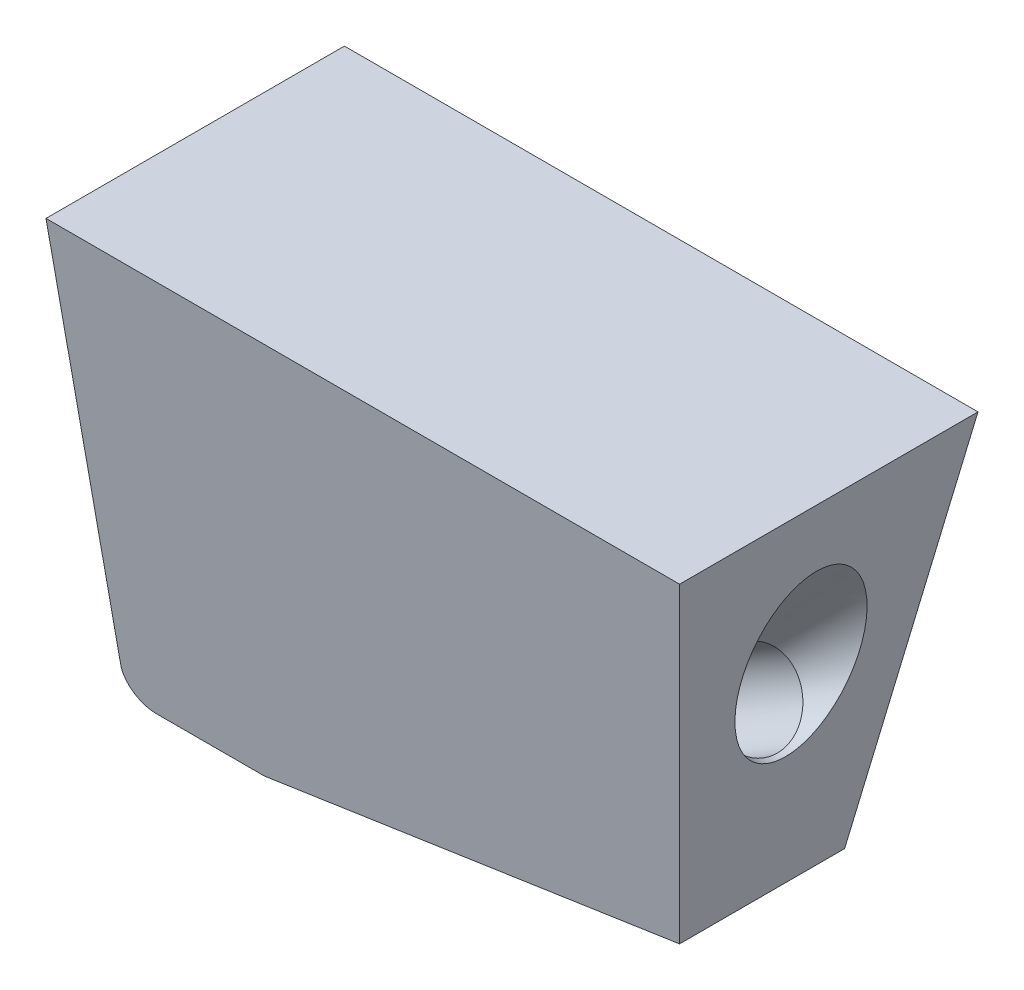
ISO-10303-21;
HEADER;
FILE_DESCRIPTION(('STEP AP214'),'2;1');
FILE_NAME('part.step','',(''),(''),'','','');
FILE_SCHEMA(('AUTOMOTIVE_DESIGN { 1 0 10303 214 1 1 1 1 }'));
ENDSEC;
DATA;
#1=APPLICATION_CONTEXT('core data for automotive mechanical design processes');
#2=APPLICATION_PROTOCOL_DEFINITION('international standard','automotive_design',2000,#1);
#3=PRODUCT_CONTEXT('',#1,'mechanical');
#4=PRODUCT('Part','Part','',(#3));
#5=PRODUCT_RELATED_PRODUCT_CATEGORY('part','',(#4));
#6=PRODUCT_DEFINITION_FORMATION('','',#4);
#7=PRODUCT_DEFINITION_CONTEXT('part definition',#1,'design');
#8=PRODUCT_DEFINITION('design','',#6,#7);
#9=PRODUCT_DEFINITION_SHAPE('','',#8);
#10=(LENGTH_UNIT() NAMED_UNIT(*) SI_UNIT(.MILLI.,.METRE.));
#11=(NAMED_UNIT(*) PLANE_ANGLE_UNIT() SI_UNIT($,.RADIAN.));
#12=(NAMED_UNIT(*) SI_UNIT($,.STERADIAN.) SOLID_ANGLE_UNIT());
#13=UNCERTAINTY_MEASURE_WITH_UNIT(LENGTH_MEASURE(1.E-05),#10,'distance_accuracy_value','');
#14=(GEOMETRIC_REPRESENTATION_CONTEXT(3) GLOBAL_UNCERTAINTY_ASSIGNED_CONTEXT((#13)) GLOBAL_UNIT_ASSIGNED_CONTEXT((#10,
#11,#12)) REPRESENTATION_CONTEXT('',''));
#15=CARTESIAN_POINT('',(0.,0.,0.));
#16=DIRECTION('',(0.,0.,1.));
#17=DIRECTION('',(1.,0.,0.));
#18=AXIS2_PLACEMENT_3D('',#15,#16,#17);
#19=CARTESIAN_POINT('',(38.0505893023531,0.,0.0635));
#20=DIRECTION('',(0.,-0.173648177666931,0.984807753012208));
#21=DIRECTION('',(0.,-0.984807753012208,-0.173648177666931));
#22=AXIS2_PLACEMENT_3D('',#19,#20,#21);
#23=PLANE('',#22);
#24=DIRECTION('',(-0.171087869746036,-0.970287525247814,-0.171087869746036));
#25=VECTOR('',#24,1.);
#26=CARTESIAN_POINT('',(1.24199492958802,6.29464036149478,1.17341492958802));
#27=LINE('',#26,#25);
#28=CARTESIAN_POINT('',(0.205511421413062,0.416450285248573,0.136931421413059));
#29=VERTEX_POINT('',#28);
#30=CARTESIAN_POINT('',(0.144305865656665,0.069336329627712,0.0757258656566614));
#31=VERTEX_POINT('',#30);
#32=EDGE_CURVE('E428',#29,#31,#27,.T.);
#33=ORIENTED_EDGE('',*,*,#32,.F.);
#34=DIRECTION('',(-1.,0.,0.));
#35=VECTOR('',#34,1.);
#36=CARTESIAN_POINT('',(38.0505893023531,0.416450285248574,0.13693142141306));
#37=LINE('',#36,#35);
#38=CARTESIAN_POINT('',(-0.37592,0.416450285248574,0.136931421413061));
#39=VERTEX_POINT('',#38);
#40=EDGE_CURVE('E76',#29,#39,#37,.T.);
#41=ORIENTED_EDGE('',*,*,#40,.T.);
#42=DIRECTION('',(0.,0.984807753012208,0.173648177666931));
#43=VECTOR('',#42,1.);
#44=CARTESIAN_POINT('',(-0.37592,28.9472979590388,5.16768964878566));
#45=LINE('',#44,#43);
#46=CARTESIAN_POINT('',(-0.37592,0.0255594358987837,0.0680068181606449));
#47=VERTEX_POINT('',#46);
#48=EDGE_CURVE('E271',#47,#39,#45,.T.);
#49=ORIENTED_EDGE('',*,*,#48,.F.);
#50=CARTESIAN_POINT('',(-0.3480816,0.02794,0.0684265758409963));
#51=DIRECTION('',(0.,-0.173648177666931,0.984807753012208));
#52=DIRECTION('',(0.,-0.984807753012208,-0.173648177666931));
#53=AXIS2_PLACEMENT_3D('',#50,#51,#52);
#54=ELLIPSE('',#53,0.0283710195360877,0.02794);
#55=CARTESIAN_POINT('',(-0.3480816,0.,0.0635000000000018));
#56=VERTEX_POINT('',#55);
#57=EDGE_CURVE('E228',#56,#47,#54,.F.);
#58=ORIENTED_EDGE('',*,*,#57,.F.);
#59=DIRECTION('',(-1.,0.,0.));
#60=VECTOR('',#59,1.);
#61=CARTESIAN_POINT('',(38.0505893023531,0.,0.0635));
#62=LINE('',#61,#60);
#63=CARTESIAN_POINT('',(-0.248920000000007,0.,0.0635));
#64=VERTEX_POINT('',#63);
#65=EDGE_CURVE('E432',#64,#56,#62,.T.);
#66=ORIENTED_EDGE('',*,*,#65,.F.);
#67=DIRECTION('',(-0.984346441568213,-0.173566836012845,-0.0306045161452665));
#68=VECTOR('',#67,1.);
#69=CARTESIAN_POINT('',(36.8609267666167,6.54346723491135,1.21728982089669));
#70=LINE('',#69,#68);
#71=EDGE_CURVE('E430',#31,#64,#70,.T.);
#72=ORIENTED_EDGE('',*,*,#71,.F.);
#73=EDGE_LOOP('',(#33,#41,#49,#58,#66,#72));
#74=FACE_BOUND('',#73,.T.);
#75=ADVANCED_FACE('F47',(#74),#23,.T.);
#76=CARTESIAN_POINT('',(38.0505893023531,0.,-0.0635));
#77=DIRECTION('',(0.,-0.173648177666931,-0.984807753012208));
#78=DIRECTION('',(0.,0.984807753012208,-0.173648177666931));
#79=AXIS2_PLACEMENT_3D('',#76,#77,#78);
#80=PLANE('',#79);
#81=DIRECTION('',(0.,-0.984807753012208,0.173648177666931));
#82=VECTOR('',#81,1.);
#83=CARTESIAN_POINT('',(-0.37592,29.2217622768144,-5.21608511325123));
#84=LINE('',#83,#82);
#85=CARTESIAN_POINT('',(-0.37592,0.416450285248574,-0.136931421413061));
#86=VERTEX_POINT('',#85);
#87=CARTESIAN_POINT('',(-0.37592,0.0255594358987837,-0.0680068181606441));
#88=VERTEX_POINT('',#87);
#89=EDGE_CURVE('E55',#86,#88,#84,.T.);
#90=ORIENTED_EDGE('',*,*,#89,.F.);
#91=DIRECTION('',(1.,0.,0.));
#92=VECTOR('',#91,1.);
#93=CARTESIAN_POINT('',(38.0505893023531,0.416450285248574,-0.13693142141306));
#94=LINE('',#93,#92);
#95=CARTESIAN_POINT('',(0.205511421413062,0.416450285248573,-0.136931421413059));
#96=VERTEX_POINT('',#95);
#97=EDGE_CURVE('E199',#86,#96,#94,.T.);
#98=ORIENTED_EDGE('',*,*,#97,.T.);
#99=DIRECTION('',(0.171087869746036,0.970287525247814,-0.171087869746036));
#100=VECTOR('',#99,1.);
#101=CARTESIAN_POINT('',(1.24199492958802,6.29464036149478,-1.17341492958802));
#102=LINE('',#101,#100);
#103=CARTESIAN_POINT('',(0.144305865656665,0.069336329627712,-0.0757258656566614));
#104=VERTEX_POINT('',#103);
#105=EDGE_CURVE('E188',#104,#96,#102,.T.);
#106=ORIENTED_EDGE('',*,*,#105,.F.);
#107=DIRECTION('',(0.984346441568213,0.173566836012845,-0.0306045161452665));
#108=VECTOR('',#107,1.);
#109=CARTESIAN_POINT('',(36.8609267666167,6.54346723491135,-1.21728982089669));
#110=LINE('',#109,#108);
#111=CARTESIAN_POINT('',(-0.248920000000007,0.,-0.0635));
#112=VERTEX_POINT('',#111);
#113=EDGE_CURVE('E196',#112,#104,#110,.T.);
#114=ORIENTED_EDGE('',*,*,#113,.F.);
#115=DIRECTION('',(-1.,0.,0.));
#116=VECTOR('',#115,1.);
#117=CARTESIAN_POINT('',(38.0505893023531,0.,-0.0635));
#118=LINE('',#117,#116);
#119=CARTESIAN_POINT('',(-0.3480816,0.,-0.0635000000000018));
#120=VERTEX_POINT('',#119);
#121=EDGE_CURVE('E273',#112,#120,#118,.T.);
#122=ORIENTED_EDGE('',*,*,#121,.T.);
#123=CARTESIAN_POINT('',(-0.3480816,0.02794,-0.0684265758409963));
#124=DIRECTION('',(0.,-0.173648177666931,-0.984807753012208));
#125=DIRECTION('',(0.,0.984807753012208,-0.173648177666931));
#126=AXIS2_PLACEMENT_3D('',#123,#124,#125);
#127=ELLIPSE('',#126,0.0283710195360877,0.02794);
#128=EDGE_CURVE('E225',#88,#120,#127,.F.);
#129=ORIENTED_EDGE('',*,*,#128,.F.);
#130=EDGE_LOOP('',(#90,#98,#106,#114,#122,#129));
#131=FACE_BOUND('',#130,.T.);
#132=ADVANCED_FACE('F200',(#131),#80,.T.);
#133=CARTESIAN_POINT('',(-0.37592,29.999999944,-0.80247998));
#134=DIRECTION('',(-1.,0.,0.));
#135=DIRECTION('',(0.,0.,1.));
#136=AXIS2_PLACEMENT_3D('',#133,#134,#135);
#137=PLANE('',#136);
#138=ORIENTED_EDGE('',*,*,#48,.T.);
#139=DIRECTION('',(0.,0.,-1.));
#140=VECTOR('',#139,1.);
#141=CARTESIAN_POINT('',(-0.37592,0.416450285248574,-0.80247998));
#142=LINE('',#141,#140);
#143=EDGE_CURVE('E68',#39,#86,#142,.T.);
#144=ORIENTED_EDGE('',*,*,#143,.T.);
#145=ORIENTED_EDGE('',*,*,#89,.T.);
#146=DIRECTION('',(0.,0.,-1.));
#147=VECTOR('',#146,1.);
#148=CARTESIAN_POINT('',(-0.37592,0.0255594358987817,37.5951067577949));
#149=LINE('',#148,#147);
#150=CARTESIAN_POINT('',(-0.375920000001808,0.0255595461338475,-0.0104837956292339));
#151=VERTEX_POINT('',#150);
#152=EDGE_CURVE('E211',#151,#88,#149,.T.);
#153=ORIENTED_EDGE('',*,*,#152,.F.);
#154=CARTESIAN_POINT('',(-0.37592,0.,0.0344056364847241));
#155=CARTESIAN_POINT('',(-0.37592,0.0144116560088984,0.0253708990055392));
#156=CARTESIAN_POINT('',(-0.37592,0.0284500319999992,0.0130238328179267));
#157=CARTESIAN_POINT('',(-0.37592,0.0284500319999992,-0.0130238328179267));
#158=CARTESIAN_POINT('',(-0.37592,0.0144116560088978,-0.0253708990055382));
#159=CARTESIAN_POINT('',(-0.37592,0.,-0.0344056364847241));
#160=(BOUNDED_CURVE() B_SPLINE_CURVE(3,(#154,#155,#156,#157,#158,#159),.UNSPECIFIED.,.F.,
.F.) B_SPLINE_CURVE_WITH_KNOTS((4,2,4),(1.39396020154298,1.5707963267949,1.74763245204681),
.UNSPECIFIED.) CURVE() GEOMETRIC_REPRESENTATION_ITEM() RATIONAL_B_SPLINE_CURVE((1.,1.,1.,1.,1.,1.)) REPRESENTATION_ITEM(''));
#161=CARTESIAN_POINT('',(-0.375920000000088,0.0255597991466438,0.0106336087855801));
#162=VERTEX_POINT('',#161);
#163=EDGE_CURVE('E351',#151,#162,#160,.F.);
#164=ORIENTED_EDGE('',*,*,#163,.T.);
#165=EDGE_CURVE('E220',#47,#162,#149,.T.);
#166=ORIENTED_EDGE('',*,*,#165,.F.);
#167=EDGE_LOOP('',(#138,#144,#145,#153,#164,#166));
#168=FACE_BOUND('',#167,.T.);
#169=ADVANCED_FACE('F319',(#168),#137,.T.);
#170=CARTESIAN_POINT('',(0.144305865656661,0.0693363296277119,38.4527456938784));
#171=DIRECTION('',(-0.984807753012208,0.173648177666931,0.));
#172=DIRECTION('',(-0.173648177666931,-0.984807753012208,0.));
#173=AXIS2_PLACEMENT_3D('',#170,#171,#172);
#174=PLANE('',#173);
#175=CARTESIAN_POINT('',(0.180009189299949,0.271819939905814,0.));
#176=DIRECTION('',(-0.984807753012208,0.173648177666931,0.));
#177=DIRECTION('',(0.173648177666931,0.984807753012208,0.));
#178=AXIS2_PLACEMENT_3D('',#175,#176,#177);
#179=ELLIPSE('',#178,0.0820660548594051,0.0589468715440828);
#180=CARTESIAN_POINT('',(0.194259810174599,0.352639226990481,0.));
#181=VERTEX_POINT('',#180);
#182=EDGE_CURVE('E281',#181,#181,#179,.F.);
#183=ORIENTED_EDGE('',*,*,#182,.F.);
#184=EDGE_LOOP('',(#183));
#185=FACE_BOUND('',#184,.T.);
#186=DIRECTION('',(0.,0.,-1.));
#187=VECTOR('',#186,1.);
#188=CARTESIAN_POINT('',(0.20551142141306,0.416450285248574,38.4527456938784));
#189=LINE('',#188,#187);
#190=EDGE_CURVE('E13',#29,#96,#189,.T.);
#191=ORIENTED_EDGE('',*,*,#190,.F.);
#192=ORIENTED_EDGE('',*,*,#32,.T.);
#193=DIRECTION('',(0.,0.,-1.));
#194=VECTOR('',#193,1.);
#195=CARTESIAN_POINT('',(0.144305865656661,0.0693363296277119,38.4527456938784));
#196=LINE('',#195,#194);
#197=EDGE_CURVE('E192',#31,#104,#196,.T.);
#198=ORIENTED_EDGE('',*,*,#197,.T.);
#199=ORIENTED_EDGE('',*,*,#105,.T.);
#200=EDGE_LOOP('',(#191,#192,#198,#199));
#201=FACE_BOUND('',#200,.T.);
#202=ADVANCED_FACE('F190',(#185,#201),#174,.F.);
#203=CARTESIAN_POINT('',(-0.171667122138084,0.1016,0.));
#204=DIRECTION('',(-0.500000000000004,-0.866025403784436,0.));
#205=DIRECTION('',(0.866025403784436,-0.500000000000004,0.));
#206=AXIS2_PLACEMENT_3D('',#203,#204,#205);
#207=CYLINDRICAL_SURFACE('',#206,0.0381);
#208=DIRECTION('',(-0.500000000000004,-0.866025403784436,0.));
#209=VECTOR('',#208,1.);
#210=CARTESIAN_POINT('',(-0.204201190820005,0.120383553311342,-0.00635));
#211=LINE('',#210,#209);
#212=CARTESIAN_POINT('',(-0.272003262441957,0.00294692040371896,-0.00635));
#213=VERTEX_POINT('',#212);
#214=CARTESIAN_POINT('',(-0.268982486856643,0.00817905719572654,-0.00635));
#215=VERTEX_POINT('',#214);
#216=EDGE_CURVE('E382',#213,#215,#211,.F.);
#217=ORIENTED_EDGE('',*,*,#216,.F.);
#218=CARTESIAN_POINT('',(-0.249224310763388,0.,0.0344056364847241));
#219=CARTESIAN_POINT('',(-0.251265245513699,0.000155917306499135,0.0335303011976228));
#220=CARTESIAN_POINT('',(-0.253236567155342,0.000336014453717778,0.0324909079121564));
#221=CARTESIAN_POINT('',(-0.256983796712376,0.00072352868299341,0.0301021833312435));
#222=CARTESIAN_POINT('',(-0.258759296959109,0.000931000855470363,0.0287522228545877));
#223=CARTESIAN_POINT('',(-0.262054353244601,0.00135198658208284,0.0257602082717701));
#224=CARTESIAN_POINT('',(-0.263573197137218,0.00156551508635467,0.0241173666119413));
#225=CARTESIAN_POINT('',(-0.266291813079525,0.00197164304030214,0.0205865947475717));
#226=CARTESIAN_POINT('',(-0.267492010712885,0.00216427020026648,0.0186989965092804));
#227=CARTESIAN_POINT('',(-0.269475334220566,0.00249507377987533,0.0148426291652261));
#228=CARTESIAN_POINT('',(-0.270277671839551,0.00263565101455654,0.0128839369199149));
#229=CARTESIAN_POINT('',(-0.271533243727165,0.00285993681419484,0.00885378156277107));
#230=CARTESIAN_POINT('',(-0.271986410841035,0.00294363443932775,0.0067822968399316));
#231=CARTESIAN_POINT('',(-0.272518765038474,0.00304233266407193,0.00266506377781953));
#232=CARTESIAN_POINT('',(-0.27261061843031,0.0030596593900815,0.00062099861260328));
#233=CARTESIAN_POINT('',(-0.272452629451527,0.00303015093454702,-0.0034532328046629));
#234=CARTESIAN_POINT('',(-0.272202831591659,0.00298332411100644,-0.00548340083262045));
#235=CARTESIAN_POINT('',(-0.271372653345109,0.00283138270163566,-0.00945512049332519));
#236=CARTESIAN_POINT('',(-0.270795000220922,0.00272674916927935,-0.0113972622206664));
#237=CARTESIAN_POINT('',(-0.269328904751489,0.00247098947414516,-0.0151563247424012));
#238=CARTESIAN_POINT('',(-0.268440552540626,0.00231987679658471,-0.0169732816703509));
#239=CARTESIAN_POINT('',(-0.266368991187112,0.00198552937614492,-0.0204536657019332));
#240=CARTESIAN_POINT('',(-0.265182712393849,0.00180196651192054,-0.022115230572601));
#241=CARTESIAN_POINT('',(-0.262555851832211,0.0014229728531968,-0.0252239838253833));
#242=CARTESIAN_POINT('',(-0.261115035994521,0.00122753124459592,-0.0266709726134355));
#243=CARTESIAN_POINT('',(-0.258022710724875,0.00084452863222295,-0.0293197711057591));
#244=CARTESIAN_POINT('',(-0.25637112720222,0.000656970430658043,-0.0305214942043257));
#245=CARTESIAN_POINT('',(-0.252907096238622,0.000306276558369561,-0.0326627490190239));
#246=CARTESIAN_POINT('',(-0.251094919946924,0.000143100925457669,-0.0336027119846616));
#247=CARTESIAN_POINT('',(-0.249224310763386,0.,-0.0344056364847213));
#248=B_SPLINE_CURVE_WITH_KNOTS('',3,(#218,#219,#220,#221,#222,#223,#224,#225,#226,#227,#228,
#229,#230,#231,#232,#233,#234,#235,#236,#237,#238,#239,#240,#241,#242,#243,#244,#245,#246,#247),
.UNSPECIFIED.,.F.,.F.,(4,2,2,2,2,2,2,2,2,2,2,2,2,2,4),(0.,0.00667534853800554,
0.0133643417163049,0.0200716005253053,0.0267698555389964,0.0331019733540892,0.0394353086997849,
0.0455445309233154,0.0516529573055327,0.0577113002609494,0.0637678871356552,0.0698896393995987,
0.0760170507409397,0.0821466220017567,0.0882660342390724),.UNSPECIFIED.);
#249=CARTESIAN_POINT('',(-0.249224310763389,0.,-0.034405636484724));
#250=VERTEX_POINT('',#249);
#251=EDGE_CURVE('E304',#213,#250,#248,.T.);
#252=ORIENTED_EDGE('',*,*,#251,.T.);
#253=CARTESIAN_POINT('',(-0.230325909487751,0.,0.));
#254=DIRECTION('',(0.,1.,0.));
#255=DIRECTION('',(-1.,0.,0.));
#256=AXIS2_PLACEMENT_3D('',#253,#254,#255);
#257=ELLIPSE('',#256,0.0439940905122496,0.0381);
#258=CARTESIAN_POINT('',(-0.24892,0.,-0.034529767571137));
#259=VERTEX_POINT('',#258);
#260=EDGE_CURVE('E420',#250,#259,#257,.F.);
#261=ORIENTED_EDGE('',*,*,#260,.T.);
#262=CARTESIAN_POINT('',(-0.228218440422588,0.00365024349624154,0.));
#263=DIRECTION('',(-0.173648177666931,0.984807753012208,0.));
#264=DIRECTION('',(-0.984807753012208,-0.173648177666931,0.));
#265=AXIS2_PLACEMENT_3D('',#262,#263,#264);
#266=ELLIPSE('',#265,0.0497360177235601,0.0381);
#267=CARTESIAN_POINT('',(-0.228218440422588,0.00365024349624158,-0.0380999999999996));
#268=VERTEX_POINT('',#267);
#269=EDGE_CURVE('E289',#268,#259,#266,.T.);
#270=ORIENTED_EDGE('',*,*,#269,.F.);
#271=DIRECTION('',(0.500000000000004,0.866025403784436,0.));
#272=VECTOR('',#271,1.);
#273=CARTESIAN_POINT('',(-0.171667122138084,0.1016,-0.0381));
#274=LINE('',#273,#272);
#275=CARTESIAN_POINT('',(-0.171667122138084,0.1016,-0.0381));
#276=VERTEX_POINT('',#275);
#277=EDGE_CURVE('E416',#268,#276,#274,.T.);
#278=ORIENTED_EDGE('',*,*,#277,.T.);
#279=CARTESIAN_POINT('',(-0.171667122138084,0.1016,0.));
#280=DIRECTION('',(0.,-1.,0.));
#281=DIRECTION('',(-1.,0.,0.));
#282=AXIS2_PLACEMENT_3D('',#279,#280,#281);
#283=ELLIPSE('',#282,0.0439940905122496,0.0381);
#284=CARTESIAN_POINT('',(-0.171667122138084,0.1016,0.0381));
#285=VERTEX_POINT('',#284);
#286=EDGE_CURVE('E418',#276,#285,#283,.F.);
#287=ORIENTED_EDGE('',*,*,#286,.T.);
#288=DIRECTION('',(-0.500000000000004,-0.866025403784436,0.));
#289=VECTOR('',#288,1.);
#290=CARTESIAN_POINT('',(-0.172744432115812,0.0997340443830741,0.0381));
#291=LINE('',#290,#289);
#292=CARTESIAN_POINT('',(-0.228218440422588,0.00365024349624157,0.0380999999999996));
#293=VERTEX_POINT('',#292);
#294=EDGE_CURVE('E410',#285,#293,#291,.T.);
#295=ORIENTED_EDGE('',*,*,#294,.T.);
#296=CARTESIAN_POINT('',(-0.24892,0.,0.034529767571137));
#297=VERTEX_POINT('',#296);
#298=EDGE_CURVE('E293',#297,#293,#266,.T.);
#299=ORIENTED_EDGE('',*,*,#298,.F.);
#300=CARTESIAN_POINT('',(-0.249224310763388,0.,0.0344056364847241));
#301=VERTEX_POINT('',#300);
#302=EDGE_CURVE('E284',#297,#301,#257,.F.);
#303=ORIENTED_EDGE('',*,*,#302,.T.);
#304=CARTESIAN_POINT('',(-0.272003262441946,0.00294692040371905,0.00634999999999807));
#305=VERTEX_POINT('',#304);
#306=EDGE_CURVE('E295',#301,#305,#248,.T.);
#307=ORIENTED_EDGE('',*,*,#306,.T.);
#308=DIRECTION('',(-0.500000000000004,-0.866025403784436,0.));
#309=VECTOR('',#308,1.);
#310=CARTESIAN_POINT('',(-0.204201190820005,0.120383553311342,0.00635));
#311=LINE('',#310,#309);
#312=CARTESIAN_POINT('',(-0.268982486856643,0.00817905719572654,0.00635));
#313=VERTEX_POINT('',#312);
#314=EDGE_CURVE('E459',#305,#313,#311,.F.);
#315=ORIENTED_EDGE('',*,*,#314,.T.);
#316=CARTESIAN_POINT('',(-0.268982486856643,-0.0669551560496381,0.));
#317=DIRECTION('',(1.,0.,0.));
#318=DIRECTION('',(0.,-1.,0.));
#319=AXIS2_PLACEMENT_3D('',#316,#317,#318);
#320=ELLIPSE('',#319,0.0761999999999994,0.0381);
#321=CARTESIAN_POINT('',(-0.268982486856643,0.00924484395036143,0.));
#322=VERTEX_POINT('',#321);
#323=EDGE_CURVE('E371',#313,#322,#320,.F.);
#324=ORIENTED_EDGE('',*,*,#323,.T.);
#325=EDGE_CURVE('E443',#322,#215,#320,.F.);
#326=ORIENTED_EDGE('',*,*,#325,.T.);
#327=EDGE_LOOP('',(#217,#252,#261,#270,#278,#287,#295,#299,#303,#307,#315,#324,#326));
#328=FACE_BOUND('',#327,.T.);
#329=ADVANCED_FACE('F307',(#328),#207,.F.);
#330=CARTESIAN_POINT('',(37.8918393023531,-0.192529968,0.));
#331=DIRECTION('',(-1.,0.,0.));
#332=DIRECTION('',(0.,0.,1.));
#333=AXIS2_PLACEMENT_3D('',#330,#331,#332);
#334=CYLINDRICAL_SURFACE('',#333,0.19558);
#335=DIRECTION('',(-1.,0.,0.));
#336=VECTOR('',#335,1.);
#337=CARTESIAN_POINT('',(37.8918393023531,0.,0.0344056364847241));
#338=LINE('',#337,#336);
#339=CARTESIAN_POINT('',(-0.348081600000001,0.,0.0344056364847257));
#340=VERTEX_POINT('',#339);
#341=EDGE_CURVE('E373',#301,#340,#338,.T.);
#342=ORIENTED_EDGE('',*,*,#341,.T.);
#343=CARTESIAN_POINT('',(-0.3480816,0.,0.034405636484724));
#344=CARTESIAN_POINT('',(-0.348393593839737,-1.79966997590522E-07,0.0344065232334275));
#345=CARTESIAN_POINT('',(-0.348704358837007,5.21872086991601E-06,0.034376439277176));
#346=CARTESIAN_POINT('',(-0.34931166356868,2.55061271704325E-05,0.0342626785365517));
#347=CARTESIAN_POINT('',(-0.349608334398268,4.02725998768387E-05,0.0341796920415574));
#348=CARTESIAN_POINT('',(-0.350252441128098,8.21489238627212E-05,0.033942971256401));
#349=CARTESIAN_POINT('',(-0.350595195194685,0.000111357669117432,0.033777113776269));
#350=CARTESIAN_POINT('',(-0.351250394413014,0.000178311741948281,0.0333930226458471));
#351=CARTESIAN_POINT('',(-0.351562668651474,0.000216101649977153,0.0331745150945662));
#352=CARTESIAN_POINT('',(-0.352347270219596,0.000323128344517251,0.0325480129696604));
#353=CARTESIAN_POINT('',(-0.352793493764451,0.000396967772787393,0.0321084852966628));
#354=CARTESIAN_POINT('',(-0.353617064561834,0.00055065505110076,0.0311711336010427));
#355=CARTESIAN_POINT('',(-0.35399426253347,0.000630515408313336,0.0306731869629386));
#356=CARTESIAN_POINT('',(-0.355078277619809,0.00087955160700143,0.0290770242409087));
#357=CARTESIAN_POINT('',(-0.355694157352238,0.00105084218849665,0.0279181692062195));
#358=CARTESIAN_POINT('',(-0.356772181187195,0.00138028372922168,0.0255310848987608));
#359=CARTESIAN_POINT('',(-0.35723385892269,0.00153839376241499,0.02430265808475));
#360=CARTESIAN_POINT('',(-0.358616013210691,0.00204019990402329,0.0200729731943522));
#361=CARTESIAN_POINT('',(-0.359280982525933,0.00233599742942755,0.0169833732346479));
#362=CARTESIAN_POINT('',(-0.360241238458901,0.00278053086917812,0.0107379776695389));
#363=CARTESIAN_POINT('',(-0.360535215147852,0.00292874529967907,0.00758198728859095));
#364=CARTESIAN_POINT('',(-0.360843849227645,0.00308403035415382,0.00069890280514433));
#365=CARTESIAN_POINT('',(-0.360800757567769,0.00306192985145632,-0.00303167014324783));
#366=CARTESIAN_POINT('',(-0.360289708604244,0.00280601658765718,-0.0104418963702981));
#367=CARTESIAN_POINT('',(-0.359823866512437,0.00257325786066393,-0.0141217106545332));
#368=CARTESIAN_POINT('',(-0.358613883421268,0.00205682108199353,-0.0197938659859511));
#369=CARTESIAN_POINT('',(-0.358074858045608,0.00183782137117089,-0.0218329151073733));
#370=CARTESIAN_POINT('',(-0.356984271451863,0.00145300880231602,-0.0249700077965995));
#371=CARTESIAN_POINT('',(-0.356532592295293,0.00130335781815908,-0.0261043589762568));
#372=CARTESIAN_POINT('',(-0.355489304349856,0.000994219304245256,-0.0283043061810107));
#373=CARTESIAN_POINT('',(-0.354898377839313,0.000834782454229174,-0.0293702061793866));
#374=CARTESIAN_POINT('',(-0.353939616619572,0.000619743790301186,-0.030738802321844));
#375=CARTESIAN_POINT('',(-0.353661822883085,0.000561274129126987,-0.0311036292481402));
#376=CARTESIAN_POINT('',(-0.35306907270226,0.000447073654707642,-0.0318044453597252));
#377=CARTESIAN_POINT('',(-0.352754022930163,0.000391350237100875,-0.0321403583193516));
#378=CARTESIAN_POINT('',(-0.352076315492417,0.000284889287858642,-0.0327730342592133));
#379=CARTESIAN_POINT('',(-0.351713028589594,0.000234236655208683,-0.0330691523657204));
#380=CARTESIAN_POINT('',(-0.350940168798109,0.000143922365646474,-0.0335913345782474));
#381=CARTESIAN_POINT('',(-0.350530985339002,0.00010417682633001,-0.0338179350089546));
#382=CARTESIAN_POINT('',(-0.349783677494717,5.01185949619308E-05,-0.0341242659637313));
#383=CARTESIAN_POINT('',(-0.349455510224046,3.18557522527272E-05,-0.0342270136639292));
#384=CARTESIAN_POINT('',(-0.348779608552955,6.56725534314714E-06,-0.0343689001650836));
#385=CARTESIAN_POINT('',(-0.348431633243962,-2.57638863839587E-07,-0.0344069027402337));
#386=CARTESIAN_POINT('',(-0.348081600219947,-5.13014857498826E-11,-0.034405637011603));
#387=B_SPLINE_CURVE_WITH_KNOTS('',3,(#343,#344,#345,#346,#347,#348,#349,#350,#351,#352,#353,
#354,#355,#356,#357,#358,#359,#360,#361,#362,#363,#364,#365,#366,#367,#368,#369,#370,#371,#372,
#373,#374,#375,#376,#377,#378,#379,#380,#381,#382,#383,#384,#385,#386),.UNSPECIFIED.,.F.,.F.,(4,
2,2,2,2,2,2,2,2,2,2,2,2,2,2,2,2,2,2,2,2,4),(0.,0.000932508810228563,0.00185309227624897,
0.00299235973760984,0.00413768706483791,0.00601902553022536,0.00790438586328679,
0.0118526978152344,0.0158128451031081,0.0252834990058188,0.034787499892477,0.0459513465532018,
0.0570596415605693,0.0634026197673817,0.0670879214003418,0.0707555282362808,0.0721405657368243,
0.0735291493896541,0.0749380540247277,0.0763357985954981,0.0773626346370325,0.0784073119947528),.UNSPECIFIED.);
#388=CARTESIAN_POINT('',(-0.358996738407187,0.00222740390085027,0.0179143167779073));
#389=VERTEX_POINT('',#388);
#390=EDGE_CURVE('E224',#340,#389,#387,.T.);
#391=ORIENTED_EDGE('',*,*,#390,.T.);
#392=CARTESIAN_POINT('',(-0.37592,0.,-0.0344056364847241));
#393=CARTESIAN_POINT('',(-0.363216829909297,0.00202744708283648,-0.0230602767744477));
#394=CARTESIAN_POINT('',(-0.35052,0.003050032,-0.0115284862277323));
#395=CARTESIAN_POINT('',(-0.35052,0.003050032,0.0115284862277322));
#396=CARTESIAN_POINT('',(-0.363216829909297,0.00202744708283651,0.0230602767744476));
#397=CARTESIAN_POINT('',(-0.37592,0.,0.0344056364847241));
#398=(BOUNDED_CURVE() B_SPLINE_CURVE(3,(#392,#393,#394,#395,#396,#397),.UNSPECIFIED.,.F.,
.F.) B_SPLINE_CURVE_WITH_KNOTS((4,2,4),(1.39396020154298,1.5707963267949,1.74763245204681),
.UNSPECIFIED.) CURVE() GEOMETRIC_REPRESENTATION_ITEM() RATIONAL_B_SPLINE_CURVE((1.,1.,1.,1.,1.,1.)) REPRESENTATION_ITEM(''));
#399=CARTESIAN_POINT('',(-0.359010750954319,0.00222612234718114,-0.0179299198577542));
#400=VERTEX_POINT('',#399);
#401=EDGE_CURVE('E365',#389,#400,#398,.F.);
#402=ORIENTED_EDGE('',*,*,#401,.T.);
#403=CARTESIAN_POINT('',(-0.348081600000001,0.,-0.0344056364847257));
#404=VERTEX_POINT('',#403);
#405=EDGE_CURVE('E214',#400,#404,#387,.T.);
#406=ORIENTED_EDGE('',*,*,#405,.T.);
#407=DIRECTION('',(-1.,0.,0.));
#408=VECTOR('',#407,1.);
#409=CARTESIAN_POINT('',(37.8918393023531,0.,-0.034405636484724));
#410=LINE('',#409,#408);
#411=EDGE_CURVE('E381',#250,#404,#410,.T.);
#412=ORIENTED_EDGE('',*,*,#411,.F.);
#413=ORIENTED_EDGE('',*,*,#251,.F.);
#414=DIRECTION('',(-1.,0.,0.));
#415=VECTOR('',#414,1.);
#416=CARTESIAN_POINT('',(37.8918393023531,0.00294692040371896,-0.00635));
#417=LINE('',#416,#415);
#418=CARTESIAN_POINT('',(-0.28628588959051,0.00294692040371595,-0.00635));
#419=VERTEX_POINT('',#418);
#420=EDGE_CURVE('E447',#419,#213,#417,.F.);
#421=ORIENTED_EDGE('',*,*,#420,.F.);
#422=CARTESIAN_POINT('',(-0.823354226504973,-0.192529968,0.));
#423=DIRECTION('',(-0.342020143325664,0.93969262078591,0.));
#424=DIRECTION('',(-0.93969262078591,-0.342020143325664,0.));
#425=AXIS2_PLACEMENT_3D('',#422,#423,#424);
#426=ELLIPSE('',#425,0.571837664583905,0.19558);
#427=CARTESIAN_POINT('',(-0.28628588959051,0.00294692040371595,0.00635));
#428=VERTEX_POINT('',#427);
#429=EDGE_CURVE('E449',#419,#428,#426,.F.);
#430=ORIENTED_EDGE('',*,*,#429,.T.);
#431=DIRECTION('',(-1.,0.,0.));
#432=VECTOR('',#431,1.);
#433=CARTESIAN_POINT('',(37.8918393023531,0.00294692040371896,0.00635));
#434=LINE('',#433,#432);
#435=EDGE_CURVE('E303',#428,#305,#434,.F.);
#436=ORIENTED_EDGE('',*,*,#435,.T.);
#437=ORIENTED_EDGE('',*,*,#306,.F.);
#438=EDGE_LOOP('',(#342,#391,#402,#406,#412,#413,#421,#430,#436,#437));
#439=FACE_BOUND('',#438,.T.);
#440=ADVANCED_FACE('F238',(#439),#334,.F.);
#441=CARTESIAN_POINT('',(0.,0.,0.));
#442=DIRECTION('',(0.,1.,0.));
#443=DIRECTION('',(0.,0.,1.));
#444=AXIS2_PLACEMENT_3D('',#441,#442,#443);
#445=PLANE('',#444);
#446=ORIENTED_EDGE('',*,*,#65,.T.);
#447=DIRECTION('',(0.,0.,-1.));
#448=VECTOR('',#447,1.);
#449=CARTESIAN_POINT('',(-0.3480816,0.,37.5951067577949));
#450=LINE('',#449,#448);
#451=EDGE_CURVE('E210',#56,#340,#450,.T.);
#452=ORIENTED_EDGE('',*,*,#451,.T.);
#453=ORIENTED_EDGE('',*,*,#341,.F.);
#454=ORIENTED_EDGE('',*,*,#302,.F.);
#455=DIRECTION('',(0.,0.,-1.));
#456=VECTOR('',#455,1.);
#457=CARTESIAN_POINT('',(-0.24892,0.,38.4527456938784));
#458=LINE('',#457,#456);
#459=EDGE_CURVE('E425',#64,#297,#458,.T.);
#460=ORIENTED_EDGE('',*,*,#459,.F.);
#461=EDGE_LOOP('',(#446,#452,#453,#454,#460));
#462=FACE_BOUND('',#461,.T.);
#463=ADVANCED_FACE('F462',(#462),#445,.F.);
#464=ORIENTED_EDGE('',*,*,#411,.T.);
#465=EDGE_CURVE('E206',#404,#120,#450,.T.);
#466=ORIENTED_EDGE('',*,*,#465,.T.);
#467=ORIENTED_EDGE('',*,*,#121,.F.);
#468=EDGE_CURVE('E424',#259,#112,#458,.T.);
#469=ORIENTED_EDGE('',*,*,#468,.F.);
#470=ORIENTED_EDGE('',*,*,#260,.F.);
#471=EDGE_LOOP('',(#464,#466,#467,#469,#470));
#472=FACE_BOUND('',#471,.T.);
#473=ADVANCED_FACE('F325',(#472),#445,.F.);
#474=CARTESIAN_POINT('',(-0.24892,0.,38.4527456938784));
#475=DIRECTION('',(-0.173648177666931,0.984807753012208,0.));
#476=DIRECTION('',(-0.984807753012208,-0.173648177666931,0.));
#477=AXIS2_PLACEMENT_3D('',#474,#475,#476);
#478=PLANE('',#477);
#479=ORIENTED_EDGE('',*,*,#459,.T.);
#480=ORIENTED_EDGE('',*,*,#298,.T.);
#481=DIRECTION('',(-0.984807753012208,-0.173648177666931,0.));
#482=VECTOR('',#481,1.);
#483=CARTESIAN_POINT('',(-0.24892,0.,0.0380999999999992));
#484=LINE('',#483,#482);
#485=CARTESIAN_POINT('',(-0.0711200000000001,0.0313509371699653,0.0380999999999996));
#486=VERTEX_POINT('',#485);
#487=EDGE_CURVE('E292',#486,#293,#484,.T.);
#488=ORIENTED_EDGE('',*,*,#487,.F.);
#489=DIRECTION('',(0.,0.,1.));
#490=VECTOR('',#489,1.);
#491=CARTESIAN_POINT('',(-0.0711200000000001,0.0313509371699652,38.4527456938784));
#492=LINE('',#491,#490);
#493=CARTESIAN_POINT('',(-0.0711200000000001,0.0313509371699653,-0.0380999999999996));
#494=VERTEX_POINT('',#493);
#495=EDGE_CURVE('E287',#494,#486,#492,.T.);
#496=ORIENTED_EDGE('',*,*,#495,.F.);
#497=DIRECTION('',(-0.984807753012208,-0.173648177666931,0.));
#498=VECTOR('',#497,1.);
#499=CARTESIAN_POINT('',(-0.24892,0.,-0.0380999999999992));
#500=LINE('',#499,#498);
#501=EDGE_CURVE('E280',#494,#268,#500,.T.);
#502=ORIENTED_EDGE('',*,*,#501,.T.);
#503=ORIENTED_EDGE('',*,*,#269,.T.);
#504=ORIENTED_EDGE('',*,*,#468,.T.);
#505=ORIENTED_EDGE('',*,*,#113,.T.);
#506=ORIENTED_EDGE('',*,*,#197,.F.);
#507=ORIENTED_EDGE('',*,*,#71,.T.);
#508=EDGE_LOOP('',(#479,#480,#488,#496,#502,#503,#504,#505,#506,#507));
#509=FACE_BOUND('',#508,.T.);
#510=ADVANCED_FACE('F321',(#509),#478,.F.);
#511=CARTESIAN_POINT('',(-0.0711200000000001,0.1016,0.0381));
#512=DIRECTION('',(-1.,0.,0.));
#513=DIRECTION('',(0.,0.,1.));
#514=AXIS2_PLACEMENT_3D('',#511,#512,#513);
#515=PLANE('',#514);
#516=ORIENTED_EDGE('',*,*,#495,.T.);
#517=DIRECTION('',(0.,1.,0.));
#518=VECTOR('',#517,1.);
#519=CARTESIAN_POINT('',(-0.0711200000000001,0.1016,0.0381));
#520=LINE('',#519,#518);
#521=CARTESIAN_POINT('',(-0.0711200000000001,0.1016,0.0381));
#522=VERTEX_POINT('',#521);
#523=EDGE_CURVE('E407',#486,#522,#520,.T.);
#524=ORIENTED_EDGE('',*,*,#523,.T.);
#525=CARTESIAN_POINT('',(-0.0711200000000001,0.1016,0.));
#526=DIRECTION('',(1.,0.,0.));
#527=DIRECTION('',(0.,1.,0.));
#528=AXIS2_PLACEMENT_3D('',#525,#526,#527);
#529=ELLIPSE('',#528,0.0439940905122494,0.0381000000000001);
#530=CARTESIAN_POINT('',(-0.0711200000000001,0.1016,-0.0380999999999992));
#531=VERTEX_POINT('',#530);
#532=EDGE_CURVE('E396',#531,#522,#529,.F.);
#533=ORIENTED_EDGE('',*,*,#532,.F.);
#534=DIRECTION('',(0.,1.,0.));
#535=VECTOR('',#534,1.);
#536=CARTESIAN_POINT('',(-0.0711200000000001,0.1016,-0.0381));
#537=LINE('',#536,#535);
#538=EDGE_CURVE('E408',#494,#531,#537,.T.);
#539=ORIENTED_EDGE('',*,*,#538,.F.);
#540=EDGE_LOOP('',(#516,#524,#533,#539));
#541=FACE_BOUND('',#540,.T.);
#542=ADVANCED_FACE('F324',(#541),#515,.T.);
#543=CARTESIAN_POINT('',(0.,0.,0.0381));
#544=DIRECTION('',(0.,0.,-1.));
#545=DIRECTION('',(-1.,0.,0.));
#546=AXIS2_PLACEMENT_3D('',#543,#544,#545);
#547=PLANE('',#546);
#548=ORIENTED_EDGE('',*,*,#487,.T.);
#549=ORIENTED_EDGE('',*,*,#294,.F.);
#550=DIRECTION('',(-1.,0.,0.));
#551=VECTOR('',#550,1.);
#552=CARTESIAN_POINT('',(-0.215661212650333,0.1016,0.0381));
#553=LINE('',#552,#551);
#554=EDGE_CURVE('E404',#522,#285,#553,.T.);
#555=ORIENTED_EDGE('',*,*,#554,.F.);
#556=ORIENTED_EDGE('',*,*,#523,.F.);
#557=EDGE_LOOP('',(#548,#549,#555,#556));
#558=FACE_BOUND('',#557,.T.);
#559=ADVANCED_FACE('F512',(#558),#547,.T.);
#560=CARTESIAN_POINT('',(0.,0.,-0.0381));
#561=DIRECTION('',(0.,0.,-1.));
#562=DIRECTION('',(-1.,0.,0.));
#563=AXIS2_PLACEMENT_3D('',#560,#561,#562);
#564=PLANE('',#563);
#565=ORIENTED_EDGE('',*,*,#538,.T.);
#566=DIRECTION('',(-1.,0.,0.));
#567=VECTOR('',#566,1.);
#568=CARTESIAN_POINT('',(-0.215661212650333,0.1016,-0.0381));
#569=LINE('',#568,#567);
#570=EDGE_CURVE('E403',#531,#276,#569,.T.);
#571=ORIENTED_EDGE('',*,*,#570,.T.);
#572=ORIENTED_EDGE('',*,*,#277,.F.);
#573=ORIENTED_EDGE('',*,*,#501,.F.);
#574=EDGE_LOOP('',(#565,#571,#572,#573));
#575=FACE_BOUND('',#574,.T.);
#576=ADVANCED_FACE('F515',(#575),#564,.F.);
#577=CARTESIAN_POINT('',(0.13915375858163,0.223001611120617,0.));
#578=DIRECTION('',(0.866025403784441,0.499999999999995,0.));
#579=DIRECTION('',(-0.499999999999995,0.866025403784441,0.));
#580=AXIS2_PLACEMENT_3D('',#577,#578,#579);
#581=CONICAL_SURFACE('',#580,0.0381000000000001,0.392699081698725);
#582=CARTESIAN_POINT('',(0.13915375858163,0.223001611120617,0.));
#583=DIRECTION('',(0.866025403784441,0.499999999999995,0.));
#584=DIRECTION('',(-0.499999999999995,0.866025403784441,0.));
#585=AXIS2_PLACEMENT_3D('',#582,#583,#584);
#586=CIRCLE('',#585,0.0381000000000001);
#587=CARTESIAN_POINT('',(0.12010375858163,0.255997179004804,0.));
#588=VERTEX_POINT('',#587);
#589=EDGE_CURVE('E385',#588,#588,#586,.T.);
#590=ORIENTED_EDGE('',*,*,#589,.F.);
#591=EDGE_LOOP('',(#590));
#592=FACE_BOUND('',#591,.T.);
#593=ORIENTED_EDGE('',*,*,#182,.T.);
#594=EDGE_LOOP('',(#593));
#595=FACE_BOUND('',#594,.T.);
#596=ADVANCED_FACE('F509',(#592,#595),#581,.F.);
#597=CARTESIAN_POINT('',(-0.215661212650333,0.1016,0.0381));
#598=DIRECTION('',(0.,-1.,0.));
#599=DIRECTION('',(0.,0.,-1.));
#600=AXIS2_PLACEMENT_3D('',#597,#598,#599);
#601=PLANE('',#600);
#602=ORIENTED_EDGE('',*,*,#570,.F.);
#603=CARTESIAN_POINT('',(-0.07112,0.1016,0.));
#604=DIRECTION('',(0.,1.,0.));
#605=DIRECTION('',(1.,0.,0.));
#606=AXIS2_PLACEMENT_3D('',#603,#604,#605);
#607=ELLIPSE('',#606,0.0762000000000009,0.0381000000000001);
#608=EDGE_CURVE('E391',#522,#531,#607,.F.);
#609=ORIENTED_EDGE('',*,*,#608,.F.);
#610=ORIENTED_EDGE('',*,*,#554,.T.);
#611=ORIENTED_EDGE('',*,*,#286,.F.);
#612=EDGE_LOOP('',(#602,#609,#610,#611));
#613=FACE_BOUND('',#612,.T.);
#614=ADVANCED_FACE('F315',(#613),#601,.T.);
#615=CARTESIAN_POINT('',(-0.387084700849061,-0.0808223050896223,0.));
#616=DIRECTION('',(0.866025403784441,0.499999999999995,0.));
#617=DIRECTION('',(-0.499999999999995,0.866025403784441,0.));
#618=AXIS2_PLACEMENT_3D('',#615,#616,#617);
#619=CYLINDRICAL_SURFACE('',#618,0.0381000000000001);
#620=ORIENTED_EDGE('',*,*,#532,.T.);
#621=ORIENTED_EDGE('',*,*,#608,.T.);
#622=EDGE_LOOP('',(#620,#621));
#623=FACE_BOUND('',#622,.T.);
#624=ORIENTED_EDGE('',*,*,#589,.T.);
#625=EDGE_LOOP('',(#624));
#626=FACE_BOUND('',#625,.T.);
#627=ADVANCED_FACE('F499',(#623,#626),#619,.F.);
#628=CARTESIAN_POINT('',(-0.268982486856643,0.0092448439503614,-0.00635));
#629=DIRECTION('',(1.,0.,0.));
#630=DIRECTION('',(0.,0.,-1.));
#631=AXIS2_PLACEMENT_3D('',#628,#629,#630);
#632=PLANE('',#631);
#633=DIRECTION('',(0.,1.,0.));
#634=VECTOR('',#633,1.);
#635=CARTESIAN_POINT('',(-0.268982486856643,0.0092448439503614,0.00635));
#636=LINE('',#635,#634);
#637=CARTESIAN_POINT('',(-0.268982486856643,0.0092448439503614,0.00635));
#638=VERTEX_POINT('',#637);
#639=EDGE_CURVE('E467',#313,#638,#636,.T.);
#640=ORIENTED_EDGE('',*,*,#639,.T.);
#641=DIRECTION('',(0.,0.,1.));
#642=VECTOR('',#641,1.);
#643=CARTESIAN_POINT('',(-0.268982486856643,0.0092448439503614,-0.00635));
#644=LINE('',#643,#642);
#645=EDGE_CURVE('E481',#322,#638,#644,.T.);
#646=ORIENTED_EDGE('',*,*,#645,.F.);
#647=ORIENTED_EDGE('',*,*,#323,.F.);
#648=EDGE_LOOP('',(#640,#646,#647));
#649=FACE_BOUND('',#648,.T.);
#650=ADVANCED_FACE('F489',(#649),#632,.F.);
#651=CARTESIAN_POINT('',(-0.268982486856643,0.0092448439503614,-0.00635));
#652=VERTEX_POINT('',#651);
#653=EDGE_CURVE('E479',#652,#322,#644,.T.);
#654=ORIENTED_EDGE('',*,*,#653,.F.);
#655=DIRECTION('',(0.,1.,0.));
#656=VECTOR('',#655,1.);
#657=CARTESIAN_POINT('',(-0.268982486856643,0.0092448439503614,-0.00635));
#658=LINE('',#657,#656);
#659=EDGE_CURVE('E474',#215,#652,#658,.T.);
#660=ORIENTED_EDGE('',*,*,#659,.F.);
#661=ORIENTED_EDGE('',*,*,#325,.F.);
#662=EDGE_LOOP('',(#654,#660,#661));
#663=FACE_BOUND('',#662,.T.);
#664=ADVANCED_FACE('F485',(#663),#632,.F.);
#665=CARTESIAN_POINT('',(-0.268982486856643,0.0092448439503614,-0.00635));
#666=DIRECTION('',(-0.342020143325664,0.93969262078591,0.));
#667=DIRECTION('',(-0.93969262078591,-0.342020143325664,0.));
#668=AXIS2_PLACEMENT_3D('',#665,#666,#667);
#669=PLANE('',#668);
#670=DIRECTION('',(-0.93969262078591,-0.342020143325664,0.));
#671=VECTOR('',#670,1.);
#672=CARTESIAN_POINT('',(-0.268982486856643,0.0092448439503614,-0.00635));
#673=LINE('',#672,#671);
#674=EDGE_CURVE('E477',#652,#419,#673,.T.);
#675=ORIENTED_EDGE('',*,*,#674,.F.);
#676=ORIENTED_EDGE('',*,*,#653,.T.);
#677=ORIENTED_EDGE('',*,*,#645,.T.);
#678=DIRECTION('',(-0.93969262078591,-0.342020143325664,0.));
#679=VECTOR('',#678,1.);
#680=CARTESIAN_POINT('',(-0.268982486856643,0.0092448439503614,0.00635));
#681=LINE('',#680,#679);
#682=EDGE_CURVE('E469',#638,#428,#681,.T.);
#683=ORIENTED_EDGE('',*,*,#682,.T.);
#684=ORIENTED_EDGE('',*,*,#429,.F.);
#685=EDGE_LOOP('',(#675,#676,#677,#683,#684));
#686=FACE_BOUND('',#685,.T.);
#687=ADVANCED_FACE('F488',(#686),#669,.F.);
#688=CARTESIAN_POINT('',(0.,0.,-0.00635));
#689=DIRECTION('',(0.,0.,1.));
#690=DIRECTION('',(1.,0.,0.));
#691=AXIS2_PLACEMENT_3D('',#688,#689,#690);
#692=PLANE('',#691);
#693=ORIENTED_EDGE('',*,*,#216,.T.);
#694=ORIENTED_EDGE('',*,*,#659,.T.);
#695=ORIENTED_EDGE('',*,*,#674,.T.);
#696=ORIENTED_EDGE('',*,*,#420,.T.);
#697=EDGE_LOOP('',(#693,#694,#695,#696));
#698=FACE_BOUND('',#697,.T.);
#699=ADVANCED_FACE('F249',(#698),#692,.T.);
#700=CARTESIAN_POINT('',(0.,0.,0.00635));
#701=DIRECTION('',(0.,0.,1.));
#702=DIRECTION('',(1.,0.,0.));
#703=AXIS2_PLACEMENT_3D('',#700,#701,#702);
#704=PLANE('',#703);
#705=ORIENTED_EDGE('',*,*,#435,.F.);
#706=ORIENTED_EDGE('',*,*,#682,.F.);
#707=ORIENTED_EDGE('',*,*,#639,.F.);
#708=ORIENTED_EDGE('',*,*,#314,.F.);
#709=EDGE_LOOP('',(#705,#706,#707,#708));
#710=FACE_BOUND('',#709,.T.);
#711=ADVANCED_FACE('F490',(#710),#704,.F.);
#712=CARTESIAN_POINT('',(-0.37592,0.,0.0344056364847241));
#713=CARTESIAN_POINT('',(-0.363216829909297,0.00202744708283651,0.0230602767744476));
#714=CARTESIAN_POINT('',(-0.35052,0.003050032,0.0115284862277322));
#715=CARTESIAN_POINT('',(-0.35052,0.003050032,-0.0115284862277323));
#716=CARTESIAN_POINT('',(-0.363216829909297,0.00202744708283648,-0.0230602767744477));
#717=CARTESIAN_POINT('',(-0.37592,0.,-0.0344056364847241));
#718=CARTESIAN_POINT('',(-0.37592,0.,0.0344056364847241));
#719=CARTESIAN_POINT('',(-0.375919999999989,0.00202806137715776,0.0230568370640456));
#720=CARTESIAN_POINT('',(-0.375919999999999,0.00305003200000022,0.0115284862277325));
#721=CARTESIAN_POINT('',(-0.375919999999999,0.0030500320000001,-0.0115284862277324));
#722=CARTESIAN_POINT('',(-0.375919999999991,0.00202806137715576,-0.0230568370640452));
#723=CARTESIAN_POINT('',(-0.37592,0.,-0.0344056364847241));
#724=CARTESIAN_POINT('',(-0.37592,0.,0.0344056364847241));
#725=CARTESIAN_POINT('',(-0.37592,0.0144116560088984,0.0253708990055392));
#726=CARTESIAN_POINT('',(-0.37592,0.0284500319999992,0.0130238328179267));
#727=CARTESIAN_POINT('',(-0.37592,0.0284500319999992,-0.0130238328179267));
#728=CARTESIAN_POINT('',(-0.37592,0.0144116560088978,-0.0253708990055382));
#729=CARTESIAN_POINT('',(-0.37592,0.,-0.0344056364847241));
#730=(BOUNDED_SURFACE() B_SPLINE_SURFACE(2,3,((#712,#713,#714,#715,#716,#717),(#718,#719,#720,
#721,#722,#723),(#724,#725,#726,#727,#728,#729)),.UNSPECIFIED.,.F.,.F.,
.F.) B_SPLINE_SURFACE_WITH_KNOTS((3,3),(4,2,4),(0.,1.),(1.39396020154298,1.5707963267949,
1.74763245204681),.UNSPECIFIED.) GEOMETRIC_REPRESENTATION_ITEM() RATIONAL_B_SPLINE_SURFACE(((1.,
1.,1.,1.,1.,1.),(0.707106781186548,0.707106781186548,0.707106781186561,0.707106781186561,
0.707106781186548,0.707106781186548),(1.,1.,1.,1.,1.,1.))) REPRESENTATION_ITEM('') SURFACE());
#731=CARTESIAN_POINT('',(-0.375920000000175,0.025559435902895,0.0105173586072484));
#732=CARTESIAN_POINT('',(-0.375918922526232,0.0255564241175025,0.010140760293688));
#733=CARTESIAN_POINT('',(-0.375917279429895,0.0255284785410924,0.00974432838684153));
#734=CARTESIAN_POINT('',(-0.375903957972107,0.0253763112248357,0.00907274943680566));
#735=CARTESIAN_POINT('',(-0.375894721034566,0.0252761807101094,0.0087909478379651));
#736=CARTESIAN_POINT('',(-0.375865020544655,0.024982524238066,0.00828668059051518));
#737=CARTESIAN_POINT('',(-0.375844926787502,0.024792098631129,0.00806260096741925));
#738=CARTESIAN_POINT('',(-0.375746249568479,0.0239897014433332,0.00739678107606999));
#739=CARTESIAN_POINT('',(-0.37562596112723,0.0232031491728461,0.00721231805207663));
#740=CARTESIAN_POINT('',(-0.375312171384299,0.0216176998155224,0.00702466864317937));
#741=CARTESIAN_POINT('',(-0.375113366294659,0.0208233216981135,0.00703802173293116));
#742=CARTESIAN_POINT('',(-0.374650895696498,0.0192610377314752,0.00713220333439544));
#743=CARTESIAN_POINT('',(-0.374388381227695,0.0184929113738649,0.00721188948384941));
#744=CARTESIAN_POINT('',(-0.373016378292252,0.014993318389599,0.00765934273825188));
#745=CARTESIAN_POINT('',(-0.371501992173602,0.0124379590946534,0.00823189550109948));
#746=CARTESIAN_POINT('',(-0.368750786331166,0.00908226986669865,0.00935398625590446));
#747=CARTESIAN_POINT('',(-0.367741782541025,0.00803565358288701,0.00977723374084602));
#748=CARTESIAN_POINT('',(-0.365623679244115,0.00614822337614585,0.0107921738559713));
#749=CARTESIAN_POINT('',(-0.364515263696092,0.00530613175374872,0.0113827679977377));
#750=CARTESIAN_POINT('',(-0.362633427964087,0.00407001749985501,0.0126580616185877));
#751=CARTESIAN_POINT('',(-0.361852536219457,0.00361651149467454,0.013270964802687));
#752=CARTESIAN_POINT('',(-0.360444016554732,0.00287095498608768,0.0147746023102408));
#753=CARTESIAN_POINT('',(-0.359818187955,0.0025807544035954,0.0156683479523378));
#754=CARTESIAN_POINT('',(-0.359234170971824,0.00232160059454567,0.0170705655953862));
#755=CARTESIAN_POINT('',(-0.359100158248796,0.00226420083238909,0.017493090864818));
#756=CARTESIAN_POINT('',(-0.359009656103556,0.00222577845243586,0.0179303187704777));
#757=B_SPLINE_CURVE_WITH_KNOTS('',3,(#731,#732,#733,#734,#735,#736,#737,#738,#739,#740,#741,
#742,#743,#744,#745,#746,#747,#748,#749,#750,#751,#752,#753,#754,#755,#756),.UNSPECIFIED.,.F.,
.F.,(4,2,2,2,2,2,2,2,2,2,2,2,4),(0.,0.00115935497190668,0.00204707725066687,0.00290631092593214,
0.00519369958144499,0.00767334381475344,0.0101111472636318,0.0189914934056761,
0.0235188557672927,0.0280171622045393,0.0312650296011316,0.0345489840818664,0.0358849246785768),.UNSPECIFIED.);
#758=EDGE_CURVE('E61',#162,#389,#757,.T.);
#759=CARTESIAN_POINT('',(-0.359009656103483,0.00222577845240821,-0.0179303187706888));
#760=CARTESIAN_POINT('',(-0.359169696973386,0.00229299118142213,-0.0171450728601052));
#761=CARTESIAN_POINT('',(-0.359463799835733,0.00241959125043526,-0.0164213150554159));
#762=CARTESIAN_POINT('',(-0.360328098360956,0.00282190182211849,-0.0149246169153139));
#763=CARTESIAN_POINT('',(-0.360950415860253,0.00312797122961397,-0.0141884018874242));
#764=CARTESIAN_POINT('',(-0.362708180561126,0.004102364622061,-0.0125187995412144));
#765=CARTESIAN_POINT('',(-0.363921618846853,0.00487756783797001,-0.0117487297834286));
#766=CARTESIAN_POINT('',(-0.367081991527813,0.00730074697473193,-0.0100053261474995));
#767=CARTESIAN_POINT('',(-0.368957975283252,0.00918199868424483,-0.00925777187023213));
#768=CARTESIAN_POINT('',(-0.372186428002337,0.0135426176354333,-0.00798264484093597));
#769=CARTESIAN_POINT('',(-0.373516136563027,0.016042104469594,-0.00746457647774269));
#770=CARTESIAN_POINT('',(-0.374689087911742,0.0193822578606964,-0.00712561170881483));
#771=CARTESIAN_POINT('',(-0.374904296898716,0.0200822832746125,-0.00707248354055245));
#772=CARTESIAN_POINT('',(-0.375289126935864,0.02153906735736,-0.00703904012433362));
#773=CARTESIAN_POINT('',(-0.375456166757968,0.022296950993642,-0.0070622208751706));
#774=CARTESIAN_POINT('',(-0.375647971050552,0.0233733297598932,-0.00728692190932152));
#775=CARTESIAN_POINT('',(-0.375700426818211,0.0237039382716902,-0.00738319328998178));
#776=CARTESIAN_POINT('',(-0.375781172060474,0.0242733740572535,-0.00765496860615038));
#777=CARTESIAN_POINT('',(-0.375812018951673,0.0245183492165436,-0.0078148090891986));
#778=CARTESIAN_POINT('',(-0.375860316422981,0.024934335326738,-0.00822005613973021));
#779=CARTESIAN_POINT('',(-0.375877570283337,0.0251042450459344,-0.00846664706039234));
#780=CARTESIAN_POINT('',(-0.375902540928194,0.0253596866037462,-0.00900882962120535));
#781=CARTESIAN_POINT('',(-0.37590980702523,0.0254411979600161,-0.0093060940833036));
#782=CARTESIAN_POINT('',(-0.375918228415854,0.0255397638998817,-0.00991082971179608));
#783=CARTESIAN_POINT('',(-0.37591941781099,0.0255571780330402,-0.0102182341538197));
#784=CARTESIAN_POINT('',(-0.37592,0.0255594358988129,-0.0105173584666716));
#785=B_SPLINE_CURVE_WITH_KNOTS('',3,(#759,#760,#761,#762,#763,#764,#765,#766,#767,#768,#769,
#770,#771,#772,#773,#774,#775,#776,#777,#778,#779,#780,#781,#782,#783,#784),.UNSPECIFIED.,.F.,
.F.,(4,2,2,2,2,2,2,2,2,2,2,2,4),(0.,0.0023557594408351,0.00532822444365397,0.0101542243743406,
0.0183068021226612,0.0267711093963087,0.0289741151110526,0.0312794280330958,0.0323151227587818,
0.0331802163032492,0.0340576106722645,0.0349734240384585,0.0358840923065127),.UNSPECIFIED.);
#786=EDGE_CURVE('E262',#400,#151,#785,.T.);
#787=ORIENTED_EDGE('',*,*,#758,.F.);
#788=ORIENTED_EDGE('',*,*,#163,.F.);
#789=ORIENTED_EDGE('',*,*,#786,.F.);
#790=ORIENTED_EDGE('',*,*,#401,.F.);
#791=EDGE_LOOP('',(#787,#788,#789,#790));
#792=FACE_BOUND('',#791,.T.);
#793=ADVANCED_FACE('F50',(#792),#730,.T.);
#794=CARTESIAN_POINT('',(-0.3480816,0.02794,37.5951067577949));
#795=DIRECTION('',(0.,0.,-1.));
#796=DIRECTION('',(-1.,0.,0.));
#797=AXIS2_PLACEMENT_3D('',#794,#795,#796);
#798=CYLINDRICAL_SURFACE('',#797,0.02794);
#799=ORIENTED_EDGE('',*,*,#152,.T.);
#800=ORIENTED_EDGE('',*,*,#128,.T.);
#801=ORIENTED_EDGE('',*,*,#465,.F.);
#802=ORIENTED_EDGE('',*,*,#405,.F.);
#803=ORIENTED_EDGE('',*,*,#786,.T.);
#804=EDGE_LOOP('',(#799,#800,#801,#802,#803));
#805=FACE_BOUND('',#804,.T.);
#806=ADVANCED_FACE('F242',(#805),#798,.T.);
#807=ORIENTED_EDGE('',*,*,#451,.F.);
#808=ORIENTED_EDGE('',*,*,#57,.T.);
#809=ORIENTED_EDGE('',*,*,#165,.T.);
#810=ORIENTED_EDGE('',*,*,#758,.T.);
#811=ORIENTED_EDGE('',*,*,#390,.F.);
#812=EDGE_LOOP('',(#807,#808,#809,#810,#811));
#813=FACE_BOUND('',#812,.T.);
#814=ADVANCED_FACE('F247',(#813),#798,.T.);
#815=CARTESIAN_POINT('',(0.,0.416450285248574,0.));
#816=DIRECTION('',(0.,1.,0.));
#817=DIRECTION('',(0.,0.,1.));
#818=AXIS2_PLACEMENT_3D('',#815,#816,#817);
#819=PLANE('',#818);
#820=ORIENTED_EDGE('',*,*,#143,.F.);
#821=ORIENTED_EDGE('',*,*,#40,.F.);
#822=ORIENTED_EDGE('',*,*,#190,.T.);
#823=ORIENTED_EDGE('',*,*,#97,.F.);
#824=EDGE_LOOP('',(#820,#821,#822,#823));
#825=FACE_BOUND('',#824,.T.);
#826=ADVANCED_FACE('F204',(#825),#819,.T.);
#827=CLOSED_SHELL('',(#75,#132,#169,#202,#329,#440,#463,#473,#510,#542,#559,#576,#596,#614,#627,
#650,#664,#687,#699,#711,#793,#806,#814,#826));
#828=MANIFOLD_SOLID_BREP('B2',#827);
#829=ADVANCED_BREP_SHAPE_REPRESENTATION('',(#18,#828),#14);
#830=SHAPE_DEFINITION_REPRESENTATION(#9,#829);
ENDSEC;
END-ISO-10303-21;
